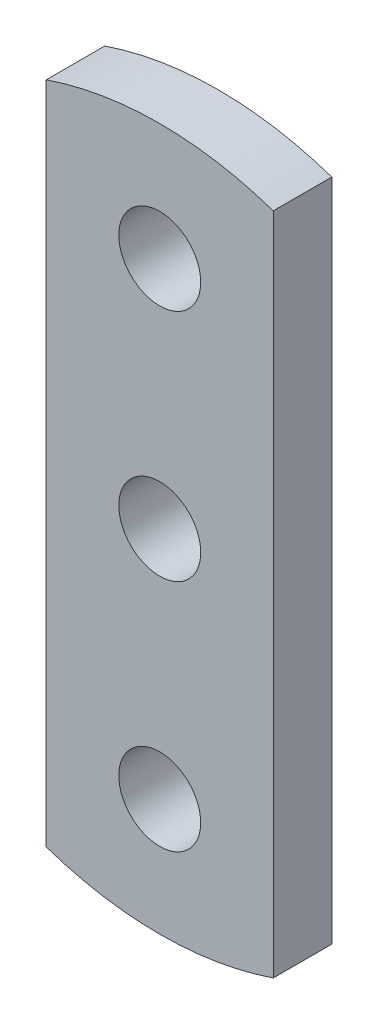
ISO-10303-21;
HEADER;
FILE_DESCRIPTION(('STEP AP214'),'2;1');
FILE_NAME('part.step','',(''),(''),'','','');
FILE_SCHEMA(('AUTOMOTIVE_DESIGN { 1 0 10303 214 1 1 1 1 }'));
ENDSEC;
DATA;
#1=APPLICATION_CONTEXT('core data for automotive mechanical design processes');
#2=APPLICATION_PROTOCOL_DEFINITION('international standard','automotive_design',2000,#1);
#3=PRODUCT_CONTEXT('',#1,'mechanical');
#4=PRODUCT('Part','Part','',(#3));
#5=PRODUCT_RELATED_PRODUCT_CATEGORY('part','',(#4));
#6=PRODUCT_DEFINITION_FORMATION('','',#4);
#7=PRODUCT_DEFINITION_CONTEXT('part definition',#1,'design');
#8=PRODUCT_DEFINITION('design','',#6,#7);
#9=PRODUCT_DEFINITION_SHAPE('','',#8);
#10=(LENGTH_UNIT() NAMED_UNIT(*) SI_UNIT(.MILLI.,.METRE.));
#11=(NAMED_UNIT(*) PLANE_ANGLE_UNIT() SI_UNIT($,.RADIAN.));
#12=(NAMED_UNIT(*) SI_UNIT($,.STERADIAN.) SOLID_ANGLE_UNIT());
#13=UNCERTAINTY_MEASURE_WITH_UNIT(LENGTH_MEASURE(1.E-05),#10,'distance_accuracy_value','');
#14=(GEOMETRIC_REPRESENTATION_CONTEXT(3) GLOBAL_UNCERTAINTY_ASSIGNED_CONTEXT((#13)) GLOBAL_UNIT_ASSIGNED_CONTEXT((#10,
#11,#12)) REPRESENTATION_CONTEXT('',''));
#15=CARTESIAN_POINT('',(0.,0.,0.));
#16=DIRECTION('',(0.,0.,1.));
#17=DIRECTION('',(1.,0.,0.));
#18=AXIS2_PLACEMENT_3D('',#15,#16,#17);
#19=CARTESIAN_POINT('',(0.,0.,2.5));
#20=DIRECTION('',(0.,0.,1.));
#21=DIRECTION('',(1.,0.,0.));
#22=AXIS2_PLACEMENT_3D('',#19,#20,#21);
#23=PLANE('',#22);
#24=CARTESIAN_POINT('',(0.,10.,2.5));
#25=DIRECTION('',(0.,0.,1.));
#26=DIRECTION('',(1.,0.,0.));
#27=AXIS2_PLACEMENT_3D('',#24,#25,#26);
#28=CIRCLE('',#27,1.75);
#29=CARTESIAN_POINT('',(1.75,10.,2.5));
#30=VERTEX_POINT('',#29);
#31=EDGE_CURVE('E121',#30,#30,#28,.T.);
#32=ORIENTED_EDGE('',*,*,#31,.F.);
#33=EDGE_LOOP('',(#32));
#34=FACE_BOUND('',#33,.T.);
#35=CARTESIAN_POINT('',(0.,0.,2.5));
#36=DIRECTION('',(0.,0.,1.));
#37=DIRECTION('',(1.,0.,0.));
#38=AXIS2_PLACEMENT_3D('',#35,#36,#37);
#39=CIRCLE('',#38,15.);
#40=CARTESIAN_POINT('',(4.85,14.1942770157553,2.5));
#41=VERTEX_POINT('',#40);
#42=CARTESIAN_POINT('',(-4.85000000000001,14.1942770157553,2.5));
#43=VERTEX_POINT('',#42);
#44=EDGE_CURVE('E91',#41,#43,#39,.T.);
#45=ORIENTED_EDGE('',*,*,#44,.T.);
#46=DIRECTION('',(0.,-1.,0.));
#47=VECTOR('',#46,1.);
#48=CARTESIAN_POINT('',(-4.85000000000001,14.1942770157553,2.5));
#49=LINE('',#48,#47);
#50=CARTESIAN_POINT('',(-4.85000000000001,-14.1942770157553,2.5));
#51=VERTEX_POINT('',#50);
#52=EDGE_CURVE('E86',#43,#51,#49,.T.);
#53=ORIENTED_EDGE('',*,*,#52,.T.);
#54=CARTESIAN_POINT('',(0.,0.,2.5));
#55=DIRECTION('',(0.,0.,1.));
#56=DIRECTION('',(1.,0.,0.));
#57=AXIS2_PLACEMENT_3D('',#54,#55,#56);
#58=CIRCLE('',#57,15.);
#59=CARTESIAN_POINT('',(4.85,-14.1942770157553,2.5));
#60=VERTEX_POINT('',#59);
#61=EDGE_CURVE('E89',#51,#60,#58,.T.);
#62=ORIENTED_EDGE('',*,*,#61,.T.);
#63=DIRECTION('',(0.,1.,0.));
#64=VECTOR('',#63,1.);
#65=CARTESIAN_POINT('',(4.85,-14.1942770157553,2.5));
#66=LINE('',#65,#64);
#67=EDGE_CURVE('E56',#60,#41,#66,.T.);
#68=ORIENTED_EDGE('',*,*,#67,.T.);
#69=EDGE_LOOP('',(#45,#53,#62,#68));
#70=FACE_BOUND('',#69,.T.);
#71=CARTESIAN_POINT('',(0.,0.,2.5));
#72=DIRECTION('',(0.,0.,1.));
#73=DIRECTION('',(1.,0.,0.));
#74=AXIS2_PLACEMENT_3D('',#71,#72,#73);
#75=CIRCLE('',#74,1.75);
#76=CARTESIAN_POINT('',(1.75,0.,2.5));
#77=VERTEX_POINT('',#76);
#78=EDGE_CURVE('E106',#77,#77,#75,.T.);
#79=ORIENTED_EDGE('',*,*,#78,.F.);
#80=EDGE_LOOP('',(#79));
#81=FACE_BOUND('',#80,.T.);
#82=CARTESIAN_POINT('',(0.,-10.,2.5));
#83=DIRECTION('',(0.,0.,1.));
#84=DIRECTION('',(1.,0.,0.));
#85=AXIS2_PLACEMENT_3D('',#82,#83,#84);
#86=CIRCLE('',#85,1.75);
#87=CARTESIAN_POINT('',(1.75,-10.,2.5));
#88=VERTEX_POINT('',#87);
#89=EDGE_CURVE('E127',#88,#88,#86,.T.);
#90=ORIENTED_EDGE('',*,*,#89,.F.);
#91=EDGE_LOOP('',(#90));
#92=FACE_BOUND('',#91,.T.);
#93=ADVANCED_FACE('F39',(#34,#70,#81,#92),#23,.T.);
#94=CARTESIAN_POINT('',(0.,0.,0.));
#95=DIRECTION('',(0.,0.,1.));
#96=DIRECTION('',(1.,0.,0.));
#97=AXIS2_PLACEMENT_3D('',#94,#95,#96);
#98=PLANE('',#97);
#99=CARTESIAN_POINT('',(0.,0.,0.));
#100=DIRECTION('',(0.,0.,1.));
#101=DIRECTION('',(1.,0.,0.));
#102=AXIS2_PLACEMENT_3D('',#99,#100,#101);
#103=CIRCLE('',#102,15.);
#104=CARTESIAN_POINT('',(4.85,14.1942770157553,0.));
#105=VERTEX_POINT('',#104);
#106=CARTESIAN_POINT('',(-4.85000000000001,14.1942770157553,0.));
#107=VERTEX_POINT('',#106);
#108=EDGE_CURVE('E103',#105,#107,#103,.T.);
#109=ORIENTED_EDGE('',*,*,#108,.F.);
#110=DIRECTION('',(0.,1.,0.));
#111=VECTOR('',#110,1.);
#112=CARTESIAN_POINT('',(4.85,-14.1942770157553,0.));
#113=LINE('',#112,#111);
#114=CARTESIAN_POINT('',(4.85,-14.1942770157553,0.));
#115=VERTEX_POINT('',#114);
#116=EDGE_CURVE('E79',#115,#105,#113,.T.);
#117=ORIENTED_EDGE('',*,*,#116,.F.);
#118=CARTESIAN_POINT('',(0.,0.,0.));
#119=DIRECTION('',(0.,0.,1.));
#120=DIRECTION('',(1.,0.,0.));
#121=AXIS2_PLACEMENT_3D('',#118,#119,#120);
#122=CIRCLE('',#121,15.);
#123=CARTESIAN_POINT('',(-4.85000000000001,-14.1942770157553,0.));
#124=VERTEX_POINT('',#123);
#125=EDGE_CURVE('E73',#124,#115,#122,.T.);
#126=ORIENTED_EDGE('',*,*,#125,.F.);
#127=DIRECTION('',(0.,-1.,0.));
#128=VECTOR('',#127,1.);
#129=CARTESIAN_POINT('',(-4.85000000000001,14.1942770157553,0.));
#130=LINE('',#129,#128);
#131=EDGE_CURVE('E95',#107,#124,#130,.T.);
#132=ORIENTED_EDGE('',*,*,#131,.F.);
#133=EDGE_LOOP('',(#109,#117,#126,#132));
#134=FACE_BOUND('',#133,.T.);
#135=CARTESIAN_POINT('',(0.,0.,0.));
#136=DIRECTION('',(0.,0.,1.));
#137=DIRECTION('',(1.,0.,0.));
#138=AXIS2_PLACEMENT_3D('',#135,#136,#137);
#139=CIRCLE('',#138,1.75);
#140=CARTESIAN_POINT('',(1.75,0.,0.));
#141=VERTEX_POINT('',#140);
#142=EDGE_CURVE('E118',#141,#141,#139,.T.);
#143=ORIENTED_EDGE('',*,*,#142,.T.);
#144=EDGE_LOOP('',(#143));
#145=FACE_BOUND('',#144,.T.);
#146=CARTESIAN_POINT('',(0.,10.,0.));
#147=DIRECTION('',(0.,0.,1.));
#148=DIRECTION('',(1.,0.,0.));
#149=AXIS2_PLACEMENT_3D('',#146,#147,#148);
#150=CIRCLE('',#149,1.75);
#151=CARTESIAN_POINT('',(1.75,10.,0.));
#152=VERTEX_POINT('',#151);
#153=EDGE_CURVE('E124',#152,#152,#150,.T.);
#154=ORIENTED_EDGE('',*,*,#153,.T.);
#155=EDGE_LOOP('',(#154));
#156=FACE_BOUND('',#155,.T.);
#157=CARTESIAN_POINT('',(0.,-10.,0.));
#158=DIRECTION('',(0.,0.,1.));
#159=DIRECTION('',(1.,0.,0.));
#160=AXIS2_PLACEMENT_3D('',#157,#158,#159);
#161=CIRCLE('',#160,1.75);
#162=CARTESIAN_POINT('',(1.75,-10.,0.));
#163=VERTEX_POINT('',#162);
#164=EDGE_CURVE('E130',#163,#163,#161,.T.);
#165=ORIENTED_EDGE('',*,*,#164,.T.);
#166=EDGE_LOOP('',(#165));
#167=FACE_BOUND('',#166,.T.);
#168=ADVANCED_FACE('F114',(#134,#145,#156,#167),#98,.F.);
#169=CARTESIAN_POINT('',(0.,0.,2.5));
#170=DIRECTION('',(0.,0.,-1.));
#171=DIRECTION('',(-1.,0.,0.));
#172=AXIS2_PLACEMENT_3D('',#169,#170,#171);
#173=CYLINDRICAL_SURFACE('',#172,15.);
#174=ORIENTED_EDGE('',*,*,#108,.T.);
#175=DIRECTION('',(0.,0.,-1.));
#176=VECTOR('',#175,1.);
#177=CARTESIAN_POINT('',(-4.85000000000001,14.1942770157553,2.5));
#178=LINE('',#177,#176);
#179=EDGE_CURVE('E11',#43,#107,#178,.T.);
#180=ORIENTED_EDGE('',*,*,#179,.F.);
#181=ORIENTED_EDGE('',*,*,#44,.F.);
#182=DIRECTION('',(0.,0.,-1.));
#183=VECTOR('',#182,1.);
#184=CARTESIAN_POINT('',(4.85,14.1942770157553,2.5));
#185=LINE('',#184,#183);
#186=EDGE_CURVE('E99',#41,#105,#185,.T.);
#187=ORIENTED_EDGE('',*,*,#186,.T.);
#188=EDGE_LOOP('',(#174,#180,#181,#187));
#189=FACE_BOUND('',#188,.T.);
#190=ADVANCED_FACE('F41',(#189),#173,.T.);
#191=CARTESIAN_POINT('',(-4.85000000000001,14.1942770157553,2.5));
#192=DIRECTION('',(1.,0.,0.));
#193=DIRECTION('',(0.,0.,-1.));
#194=AXIS2_PLACEMENT_3D('',#191,#192,#193);
#195=PLANE('',#194);
#196=ORIENTED_EDGE('',*,*,#131,.T.);
#197=DIRECTION('',(0.,0.,-1.));
#198=VECTOR('',#197,1.);
#199=CARTESIAN_POINT('',(-4.85000000000001,-14.1942770157553,2.5));
#200=LINE('',#199,#198);
#201=EDGE_CURVE('E48',#51,#124,#200,.T.);
#202=ORIENTED_EDGE('',*,*,#201,.F.);
#203=ORIENTED_EDGE('',*,*,#52,.F.);
#204=ORIENTED_EDGE('',*,*,#179,.T.);
#205=EDGE_LOOP('',(#196,#202,#203,#204));
#206=FACE_BOUND('',#205,.T.);
#207=ADVANCED_FACE('F94',(#206),#195,.F.);
#208=CARTESIAN_POINT('',(0.,0.,2.5));
#209=DIRECTION('',(0.,0.,-1.));
#210=DIRECTION('',(-1.,0.,0.));
#211=AXIS2_PLACEMENT_3D('',#208,#209,#210);
#212=CYLINDRICAL_SURFACE('',#211,15.);
#213=ORIENTED_EDGE('',*,*,#125,.T.);
#214=DIRECTION('',(0.,0.,-1.));
#215=VECTOR('',#214,1.);
#216=CARTESIAN_POINT('',(4.85,-14.1942770157553,2.5));
#217=LINE('',#216,#215);
#218=EDGE_CURVE('E96',#60,#115,#217,.T.);
#219=ORIENTED_EDGE('',*,*,#218,.F.);
#220=ORIENTED_EDGE('',*,*,#61,.F.);
#221=ORIENTED_EDGE('',*,*,#201,.T.);
#222=EDGE_LOOP('',(#213,#219,#220,#221));
#223=FACE_BOUND('',#222,.T.);
#224=ADVANCED_FACE('F97',(#223),#212,.T.);
#225=CARTESIAN_POINT('',(4.85,-14.1942770157553,2.5));
#226=DIRECTION('',(-1.,0.,0.));
#227=DIRECTION('',(0.,0.,1.));
#228=AXIS2_PLACEMENT_3D('',#225,#226,#227);
#229=PLANE('',#228);
#230=ORIENTED_EDGE('',*,*,#116,.T.);
#231=ORIENTED_EDGE('',*,*,#186,.F.);
#232=ORIENTED_EDGE('',*,*,#67,.F.);
#233=ORIENTED_EDGE('',*,*,#218,.T.);
#234=EDGE_LOOP('',(#230,#231,#232,#233));
#235=FACE_BOUND('',#234,.T.);
#236=ADVANCED_FACE('F111',(#235),#229,.F.);
#237=CARTESIAN_POINT('',(0.,0.,2.5));
#238=DIRECTION('',(0.,0.,-1.));
#239=DIRECTION('',(-1.,0.,0.));
#240=AXIS2_PLACEMENT_3D('',#237,#238,#239);
#241=CYLINDRICAL_SURFACE('',#240,1.75);
#242=ORIENTED_EDGE('',*,*,#78,.T.);
#243=EDGE_LOOP('',(#242));
#244=FACE_BOUND('',#243,.T.);
#245=ORIENTED_EDGE('',*,*,#142,.F.);
#246=EDGE_LOOP('',(#245));
#247=FACE_BOUND('',#246,.T.);
#248=ADVANCED_FACE('F148',(#244,#247),#241,.F.);
#249=CARTESIAN_POINT('',(0.,10.,2.5));
#250=DIRECTION('',(0.,0.,-1.));
#251=DIRECTION('',(-1.,0.,0.));
#252=AXIS2_PLACEMENT_3D('',#249,#250,#251);
#253=CYLINDRICAL_SURFACE('',#252,1.75);
#254=ORIENTED_EDGE('',*,*,#31,.T.);
#255=EDGE_LOOP('',(#254));
#256=FACE_BOUND('',#255,.T.);
#257=ORIENTED_EDGE('',*,*,#153,.F.);
#258=EDGE_LOOP('',(#257));
#259=FACE_BOUND('',#258,.T.);
#260=ADVANCED_FACE('F193',(#256,#259),#253,.F.);
#261=CARTESIAN_POINT('',(0.,-10.,2.5));
#262=DIRECTION('',(0.,0.,-1.));
#263=DIRECTION('',(-1.,0.,0.));
#264=AXIS2_PLACEMENT_3D('',#261,#262,#263);
#265=CYLINDRICAL_SURFACE('',#264,1.75);
#266=ORIENTED_EDGE('',*,*,#89,.T.);
#267=EDGE_LOOP('',(#266));
#268=FACE_BOUND('',#267,.T.);
#269=ORIENTED_EDGE('',*,*,#164,.F.);
#270=EDGE_LOOP('',(#269));
#271=FACE_BOUND('',#270,.T.);
#272=ADVANCED_FACE('F136',(#268,#271),#265,.F.);
#273=CLOSED_SHELL('',(#93,#168,#190,#207,#224,#236,#248,#260,#272));
#274=MANIFOLD_SOLID_BREP('B2',#273);
#275=ADVANCED_BREP_SHAPE_REPRESENTATION('',(#18,#274),#14);
#276=SHAPE_DEFINITION_REPRESENTATION(#9,#275);
ENDSEC;
END-ISO-10303-21;
